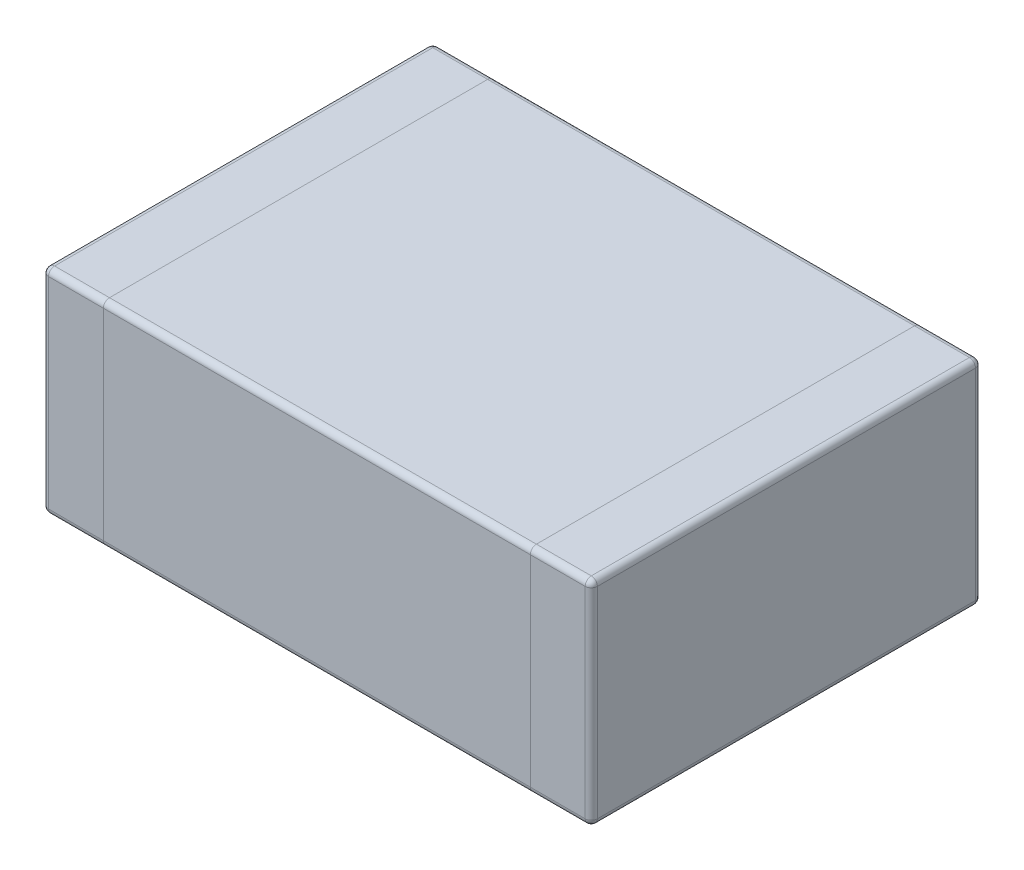
ISO-10303-21;
HEADER;
FILE_DESCRIPTION(('STEP AP214'),'2;1');
FILE_NAME('part.step','',(''),(''),'','','');
FILE_SCHEMA(('AUTOMOTIVE_DESIGN { 1 0 10303 214 1 1 1 1 }'));
ENDSEC;
DATA;
#1=APPLICATION_CONTEXT('core data for automotive mechanical design processes');
#2=APPLICATION_PROTOCOL_DEFINITION('international standard','automotive_design',2000,#1);
#3=PRODUCT_CONTEXT('',#1,'mechanical');
#4=PRODUCT('Part','Part','',(#3));
#5=PRODUCT_RELATED_PRODUCT_CATEGORY('part','',(#4));
#6=PRODUCT_DEFINITION_FORMATION('','',#4);
#7=PRODUCT_DEFINITION_CONTEXT('part definition',#1,'design');
#8=PRODUCT_DEFINITION('design','',#6,#7);
#9=PRODUCT_DEFINITION_SHAPE('','',#8);
#10=(LENGTH_UNIT() NAMED_UNIT(*) SI_UNIT(.MILLI.,.METRE.));
#11=(NAMED_UNIT(*) PLANE_ANGLE_UNIT() SI_UNIT($,.RADIAN.));
#12=(NAMED_UNIT(*) SI_UNIT($,.STERADIAN.) SOLID_ANGLE_UNIT());
#13=UNCERTAINTY_MEASURE_WITH_UNIT(LENGTH_MEASURE(1.E-05),#10,'distance_accuracy_value','');
#14=(GEOMETRIC_REPRESENTATION_CONTEXT(3) GLOBAL_UNCERTAINTY_ASSIGNED_CONTEXT((#13)) GLOBAL_UNIT_ASSIGNED_CONTEXT((#10,
#11,#12)) REPRESENTATION_CONTEXT('',''));
#15=CARTESIAN_POINT('',(0.,0.,0.));
#16=DIRECTION('',(0.,0.,1.));
#17=DIRECTION('',(1.,0.,0.));
#18=AXIS2_PLACEMENT_3D('',#15,#16,#17);
#19=CARTESIAN_POINT('',(2.25,1.75,-1.6));
#20=DIRECTION('',(0.,-1.,0.));
#21=DIRECTION('',(0.,0.,-1.));
#22=AXIS2_PLACEMENT_3D('',#19,#20,#21);
#23=PLANE('',#22);
#24=DIRECTION('',(0.,0.,1.));
#25=VECTOR('',#24,1.);
#26=CARTESIAN_POINT('',(-1.75,1.75,-1.6));
#27=LINE('',#26,#25);
#28=CARTESIAN_POINT('',(-1.75,1.75,-1.55));
#29=VERTEX_POINT('',#28);
#30=CARTESIAN_POINT('',(-1.75,1.75,1.55));
#31=VERTEX_POINT('',#30);
#32=EDGE_CURVE('E11',#29,#31,#27,.T.);
#33=ORIENTED_EDGE('',*,*,#32,.F.);
#34=DIRECTION('',(-1.,0.,0.));
#35=VECTOR('',#34,1.);
#36=CARTESIAN_POINT('',(2.25,1.75,-1.55));
#37=LINE('',#36,#35);
#38=CARTESIAN_POINT('',(-2.2,1.75,-1.55));
#39=VERTEX_POINT('',#38);
#40=EDGE_CURVE('E254',#29,#39,#37,.T.);
#41=ORIENTED_EDGE('',*,*,#40,.T.);
#42=DIRECTION('',(0.,0.,1.));
#43=VECTOR('',#42,1.);
#44=CARTESIAN_POINT('',(-2.2,1.75,-1.6));
#45=LINE('',#44,#43);
#46=CARTESIAN_POINT('',(-2.2,1.75,1.55));
#47=VERTEX_POINT('',#46);
#48=EDGE_CURVE('E257',#39,#47,#45,.T.);
#49=ORIENTED_EDGE('',*,*,#48,.T.);
#50=DIRECTION('',(1.,0.,0.));
#51=VECTOR('',#50,1.);
#52=CARTESIAN_POINT('',(2.25,1.75,1.55));
#53=LINE('',#52,#51);
#54=EDGE_CURVE('E261',#47,#31,#53,.T.);
#55=ORIENTED_EDGE('',*,*,#54,.T.);
#56=EDGE_LOOP('',(#33,#41,#49,#55));
#57=FACE_BOUND('',#56,.T.);
#58=ADVANCED_FACE('F38',(#57),#23,.F.);
#59=DIRECTION('',(0.,0.,-1.));
#60=VECTOR('',#59,1.);
#61=CARTESIAN_POINT('',(1.75,1.75,-1.6));
#62=LINE('',#61,#60);
#63=CARTESIAN_POINT('',(1.75,1.75,1.55));
#64=VERTEX_POINT('',#63);
#65=CARTESIAN_POINT('',(1.75,1.75,-1.55));
#66=VERTEX_POINT('',#65);
#67=EDGE_CURVE('E48',#64,#66,#62,.T.);
#68=ORIENTED_EDGE('',*,*,#67,.F.);
#69=CARTESIAN_POINT('',(2.2,1.75,1.55));
#70=VERTEX_POINT('',#69);
#71=EDGE_CURVE('E260',#64,#70,#53,.T.);
#72=ORIENTED_EDGE('',*,*,#71,.T.);
#73=DIRECTION('',(0.,0.,-1.));
#74=VECTOR('',#73,1.);
#75=CARTESIAN_POINT('',(2.2,1.75,-1.6));
#76=LINE('',#75,#74);
#77=CARTESIAN_POINT('',(2.2,1.75,-1.55));
#78=VERTEX_POINT('',#77);
#79=EDGE_CURVE('E251',#70,#78,#76,.T.);
#80=ORIENTED_EDGE('',*,*,#79,.T.);
#81=EDGE_CURVE('E255',#78,#66,#37,.T.);
#82=ORIENTED_EDGE('',*,*,#81,.T.);
#83=EDGE_LOOP('',(#68,#72,#80,#82));
#84=FACE_BOUND('',#83,.T.);
#85=ADVANCED_FACE('F527',(#84),#23,.F.);
#86=CARTESIAN_POINT('',(2.25,1.7,1.55));
#87=DIRECTION('',(1.,0.,0.));
#88=DIRECTION('',(0.,0.,-1.));
#89=AXIS2_PLACEMENT_3D('',#86,#87,#88);
#90=CYLINDRICAL_SURFACE('',#89,0.05);
#91=DIRECTION('',(1.,0.,0.));
#92=VECTOR('',#91,1.);
#93=CARTESIAN_POINT('',(-2.25,1.7,1.6));
#94=LINE('',#93,#92);
#95=CARTESIAN_POINT('',(-1.75,1.7,1.6));
#96=VERTEX_POINT('',#95);
#97=CARTESIAN_POINT('',(-2.2,1.7,1.6));
#98=VERTEX_POINT('',#97);
#99=EDGE_CURVE('E247',#96,#98,#94,.F.);
#100=ORIENTED_EDGE('',*,*,#99,.F.);
#101=CARTESIAN_POINT('',(-1.75,1.7,1.55));
#102=DIRECTION('',(1.,0.,0.));
#103=DIRECTION('',(0.,0.,-1.));
#104=AXIS2_PLACEMENT_3D('',#101,#102,#103);
#105=CIRCLE('',#104,0.05);
#106=EDGE_CURVE('E355',#96,#31,#105,.F.);
#107=ORIENTED_EDGE('',*,*,#106,.T.);
#108=ORIENTED_EDGE('',*,*,#54,.F.);
#109=CARTESIAN_POINT('',(-2.2,1.7,1.55));
#110=DIRECTION('',(-1.,0.,0.));
#111=DIRECTION('',(0.,-1.,0.));
#112=AXIS2_PLACEMENT_3D('',#109,#110,#111);
#113=CIRCLE('',#112,0.05);
#114=EDGE_CURVE('E331',#47,#98,#113,.F.);
#115=ORIENTED_EDGE('',*,*,#114,.T.);
#116=EDGE_LOOP('',(#100,#107,#108,#115));
#117=FACE_BOUND('',#116,.T.);
#118=ADVANCED_FACE('F484',(#117),#90,.T.);
#119=ORIENTED_EDGE('',*,*,#71,.F.);
#120=CARTESIAN_POINT('',(1.75,1.7,1.55));
#121=DIRECTION('',(-1.,0.,0.));
#122=DIRECTION('',(0.,0.,1.));
#123=AXIS2_PLACEMENT_3D('',#120,#121,#122);
#124=CIRCLE('',#123,0.05);
#125=CARTESIAN_POINT('',(1.75,1.7,1.6));
#126=VERTEX_POINT('',#125);
#127=EDGE_CURVE('E354',#64,#126,#124,.F.);
#128=ORIENTED_EDGE('',*,*,#127,.T.);
#129=CARTESIAN_POINT('',(2.2,1.7,1.6));
#130=VERTEX_POINT('',#129);
#131=EDGE_CURVE('E248',#130,#126,#94,.F.);
#132=ORIENTED_EDGE('',*,*,#131,.F.);
#133=CARTESIAN_POINT('',(2.2,1.7,1.55));
#134=DIRECTION('',(1.,0.,0.));
#135=DIRECTION('',(0.,0.,-1.));
#136=AXIS2_PLACEMENT_3D('',#133,#134,#135);
#137=CIRCLE('',#136,0.05);
#138=EDGE_CURVE('E316',#70,#130,#137,.T.);
#139=ORIENTED_EDGE('',*,*,#138,.F.);
#140=EDGE_LOOP('',(#119,#128,#132,#139));
#141=FACE_BOUND('',#140,.T.);
#142=ADVANCED_FACE('F458',(#141),#90,.T.);
#143=CARTESIAN_POINT('',(-2.25,1.75,1.6));
#144=DIRECTION('',(0.,0.,-1.));
#145=DIRECTION('',(-1.,0.,0.));
#146=AXIS2_PLACEMENT_3D('',#143,#144,#145);
#147=PLANE('',#146);
#148=DIRECTION('',(0.,-1.,0.));
#149=VECTOR('',#148,1.);
#150=CARTESIAN_POINT('',(-1.75,1.75,1.6));
#151=LINE('',#150,#149);
#152=CARTESIAN_POINT('',(-1.75,0.0499999999999999,1.6));
#153=VERTEX_POINT('',#152);
#154=EDGE_CURVE('E350',#96,#153,#151,.T.);
#155=ORIENTED_EDGE('',*,*,#154,.F.);
#156=ORIENTED_EDGE('',*,*,#99,.T.);
#157=DIRECTION('',(0.,-1.,0.));
#158=VECTOR('',#157,1.);
#159=CARTESIAN_POINT('',(-2.2,1.75,1.6));
#160=LINE('',#159,#158);
#161=CARTESIAN_POINT('',(-2.2,0.0499999999999999,1.6));
#162=VERTEX_POINT('',#161);
#163=EDGE_CURVE('E244',#98,#162,#160,.T.);
#164=ORIENTED_EDGE('',*,*,#163,.T.);
#165=DIRECTION('',(1.,0.,0.));
#166=VECTOR('',#165,1.);
#167=CARTESIAN_POINT('',(2.25,0.0499999999999999,1.6));
#168=LINE('',#167,#166);
#169=EDGE_CURVE('E238',#162,#153,#168,.T.);
#170=ORIENTED_EDGE('',*,*,#169,.T.);
#171=EDGE_LOOP('',(#155,#156,#164,#170));
#172=FACE_BOUND('',#171,.T.);
#173=ADVANCED_FACE('F472',(#172),#147,.F.);
#174=DIRECTION('',(0.,1.,0.));
#175=VECTOR('',#174,1.);
#176=CARTESIAN_POINT('',(1.75,1.75,1.6));
#177=LINE('',#176,#175);
#178=CARTESIAN_POINT('',(1.75,0.0499999999999999,1.6));
#179=VERTEX_POINT('',#178);
#180=EDGE_CURVE('E346',#179,#126,#177,.T.);
#181=ORIENTED_EDGE('',*,*,#180,.F.);
#182=CARTESIAN_POINT('',(2.2,0.0499999999999999,1.6));
#183=VERTEX_POINT('',#182);
#184=EDGE_CURVE('E237',#179,#183,#168,.T.);
#185=ORIENTED_EDGE('',*,*,#184,.T.);
#186=DIRECTION('',(0.,-1.,0.));
#187=VECTOR('',#186,1.);
#188=CARTESIAN_POINT('',(2.2,1.75,1.6));
#189=LINE('',#188,#187);
#190=EDGE_CURVE('E241',#183,#130,#189,.F.);
#191=ORIENTED_EDGE('',*,*,#190,.T.);
#192=ORIENTED_EDGE('',*,*,#131,.T.);
#193=EDGE_LOOP('',(#181,#185,#191,#192));
#194=FACE_BOUND('',#193,.T.);
#195=ADVANCED_FACE('F454',(#194),#147,.F.);
#196=CARTESIAN_POINT('',(-2.25,0.0499999999999999,1.55));
#197=DIRECTION('',(-1.,0.,0.));
#198=DIRECTION('',(0.,0.,1.));
#199=AXIS2_PLACEMENT_3D('',#196,#197,#198);
#200=CYLINDRICAL_SURFACE('',#199,0.05);
#201=DIRECTION('',(1.,0.,0.));
#202=VECTOR('',#201,1.);
#203=CARTESIAN_POINT('',(-2.25,0.,1.55));
#204=LINE('',#203,#202);
#205=CARTESIAN_POINT('',(-1.75,0.,1.55));
#206=VERTEX_POINT('',#205);
#207=CARTESIAN_POINT('',(-2.2,0.,1.55));
#208=VERTEX_POINT('',#207);
#209=EDGE_CURVE('E267',#206,#208,#204,.F.);
#210=ORIENTED_EDGE('',*,*,#209,.F.);
#211=CARTESIAN_POINT('',(-1.75,0.0499999999999999,1.55));
#212=DIRECTION('',(1.,0.,0.));
#213=DIRECTION('',(0.,0.,-1.));
#214=AXIS2_PLACEMENT_3D('',#211,#212,#213);
#215=CIRCLE('',#214,0.05);
#216=EDGE_CURVE('E351',#206,#153,#215,.F.);
#217=ORIENTED_EDGE('',*,*,#216,.T.);
#218=ORIENTED_EDGE('',*,*,#169,.F.);
#219=CARTESIAN_POINT('',(-2.2,0.05,1.55));
#220=DIRECTION('',(-1.,0.,0.));
#221=DIRECTION('',(0.,0.,1.));
#222=AXIS2_PLACEMENT_3D('',#219,#220,#221);
#223=CIRCLE('',#222,0.05);
#224=EDGE_CURVE('E322',#162,#208,#223,.F.);
#225=ORIENTED_EDGE('',*,*,#224,.T.);
#226=EDGE_LOOP('',(#210,#217,#218,#225));
#227=FACE_BOUND('',#226,.T.);
#228=ADVANCED_FACE('F510',(#227),#200,.T.);
#229=ORIENTED_EDGE('',*,*,#184,.F.);
#230=CARTESIAN_POINT('',(1.75,0.0499999999999999,1.55));
#231=DIRECTION('',(-1.,0.,0.));
#232=DIRECTION('',(0.,0.,1.));
#233=AXIS2_PLACEMENT_3D('',#230,#231,#232);
#234=CIRCLE('',#233,0.05);
#235=CARTESIAN_POINT('',(1.75,0.,1.55));
#236=VERTEX_POINT('',#235);
#237=EDGE_CURVE('E366',#179,#236,#234,.F.);
#238=ORIENTED_EDGE('',*,*,#237,.T.);
#239=CARTESIAN_POINT('',(2.2,0.,1.55));
#240=VERTEX_POINT('',#239);
#241=EDGE_CURVE('E268',#240,#236,#204,.F.);
#242=ORIENTED_EDGE('',*,*,#241,.F.);
#243=CARTESIAN_POINT('',(2.2,0.0499999999999999,1.55));
#244=DIRECTION('',(1.,0.,0.));
#245=DIRECTION('',(0.,0.,-1.));
#246=AXIS2_PLACEMENT_3D('',#243,#244,#245);
#247=CIRCLE('',#246,0.05);
#248=EDGE_CURVE('E302',#183,#240,#247,.T.);
#249=ORIENTED_EDGE('',*,*,#248,.F.);
#250=EDGE_LOOP('',(#229,#238,#242,#249));
#251=FACE_BOUND('',#250,.T.);
#252=ADVANCED_FACE('F444',(#251),#200,.T.);
#253=CARTESIAN_POINT('',(2.25,0.,-1.6));
#254=DIRECTION('',(0.,-1.,0.));
#255=DIRECTION('',(0.,0.,-1.));
#256=AXIS2_PLACEMENT_3D('',#253,#254,#255);
#257=PLANE('',#256);
#258=DIRECTION('',(-1.,0.,0.));
#259=VECTOR('',#258,1.);
#260=CARTESIAN_POINT('',(2.25,0.,-1.55));
#261=LINE('',#260,#259);
#262=CARTESIAN_POINT('',(-2.2,0.,-1.55));
#263=VERTEX_POINT('',#262);
#264=CARTESIAN_POINT('',(-1.75,0.,-1.55));
#265=VERTEX_POINT('',#264);
#266=EDGE_CURVE('E275',#263,#265,#261,.F.);
#267=ORIENTED_EDGE('',*,*,#266,.T.);
#268=DIRECTION('',(0.,0.,1.));
#269=VECTOR('',#268,1.);
#270=CARTESIAN_POINT('',(-1.75,0.,-1.6));
#271=LINE('',#270,#269);
#272=EDGE_CURVE('E367',#265,#206,#271,.T.);
#273=ORIENTED_EDGE('',*,*,#272,.T.);
#274=ORIENTED_EDGE('',*,*,#209,.T.);
#275=DIRECTION('',(0.,0.,1.));
#276=VECTOR('',#275,1.);
#277=CARTESIAN_POINT('',(-2.2,0.,-1.6));
#278=LINE('',#277,#276);
#279=EDGE_CURVE('E271',#208,#263,#278,.F.);
#280=ORIENTED_EDGE('',*,*,#279,.T.);
#281=EDGE_LOOP('',(#267,#273,#274,#280));
#282=FACE_BOUND('',#281,.T.);
#283=ADVANCED_FACE('F513',(#282),#257,.T.);
#284=ORIENTED_EDGE('',*,*,#241,.T.);
#285=DIRECTION('',(0.,0.,-1.));
#286=VECTOR('',#285,1.);
#287=CARTESIAN_POINT('',(1.75,0.,-1.6));
#288=LINE('',#287,#286);
#289=CARTESIAN_POINT('',(1.75,0.,-1.55));
#290=VERTEX_POINT('',#289);
#291=EDGE_CURVE('E361',#236,#290,#288,.T.);
#292=ORIENTED_EDGE('',*,*,#291,.T.);
#293=CARTESIAN_POINT('',(2.2,0.,-1.55));
#294=VERTEX_POINT('',#293);
#295=EDGE_CURVE('E274',#290,#294,#261,.F.);
#296=ORIENTED_EDGE('',*,*,#295,.T.);
#297=DIRECTION('',(0.,0.,-1.));
#298=VECTOR('',#297,1.);
#299=CARTESIAN_POINT('',(2.2,0.,1.6));
#300=LINE('',#299,#298);
#301=EDGE_CURVE('E264',#294,#240,#300,.F.);
#302=ORIENTED_EDGE('',*,*,#301,.T.);
#303=EDGE_LOOP('',(#284,#292,#296,#302));
#304=FACE_BOUND('',#303,.T.);
#305=ADVANCED_FACE('F388',(#304),#257,.T.);
#306=CARTESIAN_POINT('',(2.25,1.7,-1.55));
#307=DIRECTION('',(-1.,0.,0.));
#308=DIRECTION('',(0.,0.,1.));
#309=AXIS2_PLACEMENT_3D('',#306,#307,#308);
#310=CYLINDRICAL_SURFACE('',#309,0.05);
#311=ORIENTED_EDGE('',*,*,#40,.F.);
#312=CARTESIAN_POINT('',(-1.75,1.7,-1.55));
#313=DIRECTION('',(1.,0.,0.));
#314=DIRECTION('',(0.,0.,-1.));
#315=AXIS2_PLACEMENT_3D('',#312,#313,#314);
#316=CIRCLE('',#315,0.05);
#317=CARTESIAN_POINT('',(-1.75,1.7,-1.6));
#318=VERTEX_POINT('',#317);
#319=EDGE_CURVE('E358',#29,#318,#316,.F.);
#320=ORIENTED_EDGE('',*,*,#319,.T.);
#321=DIRECTION('',(-1.,0.,0.));
#322=VECTOR('',#321,1.);
#323=CARTESIAN_POINT('',(-2.25,1.7,-1.6));
#324=LINE('',#323,#322);
#325=CARTESIAN_POINT('',(-2.2,1.7,-1.6));
#326=VERTEX_POINT('',#325);
#327=EDGE_CURVE('E217',#326,#318,#324,.F.);
#328=ORIENTED_EDGE('',*,*,#327,.F.);
#329=CARTESIAN_POINT('',(-2.2,1.7,-1.55));
#330=DIRECTION('',(-1.,0.,0.));
#331=DIRECTION('',(0.,0.,1.));
#332=AXIS2_PLACEMENT_3D('',#329,#330,#331);
#333=CIRCLE('',#332,0.05);
#334=EDGE_CURVE('E293',#326,#39,#333,.F.);
#335=ORIENTED_EDGE('',*,*,#334,.T.);
#336=EDGE_LOOP('',(#311,#320,#328,#335));
#337=FACE_BOUND('',#336,.T.);
#338=ADVANCED_FACE('F520',(#337),#310,.T.);
#339=CARTESIAN_POINT('',(1.75,1.7,-1.6));
#340=VERTEX_POINT('',#339);
#341=CARTESIAN_POINT('',(2.2,1.7,-1.6));
#342=VERTEX_POINT('',#341);
#343=EDGE_CURVE('E212',#340,#342,#324,.F.);
#344=ORIENTED_EDGE('',*,*,#343,.F.);
#345=CARTESIAN_POINT('',(1.75,1.7,-1.55));
#346=DIRECTION('',(-1.,0.,0.));
#347=DIRECTION('',(0.,0.,1.));
#348=AXIS2_PLACEMENT_3D('',#345,#346,#347);
#349=CIRCLE('',#348,0.05);
#350=EDGE_CURVE('E362',#340,#66,#349,.F.);
#351=ORIENTED_EDGE('',*,*,#350,.T.);
#352=ORIENTED_EDGE('',*,*,#81,.F.);
#353=CARTESIAN_POINT('',(2.2,1.7,-1.55));
#354=DIRECTION('',(1.,0.,0.));
#355=DIRECTION('',(0.,0.,-1.));
#356=AXIS2_PLACEMENT_3D('',#353,#354,#355);
#357=CIRCLE('',#356,0.05);
#358=EDGE_CURVE('E197',#342,#78,#357,.T.);
#359=ORIENTED_EDGE('',*,*,#358,.F.);
#360=EDGE_LOOP('',(#344,#351,#352,#359));
#361=FACE_BOUND('',#360,.T.);
#362=ADVANCED_FACE('F423',(#361),#310,.T.);
#363=CARTESIAN_POINT('',(-2.25,0.0499999999999999,-1.55));
#364=DIRECTION('',(1.,0.,0.));
#365=DIRECTION('',(0.,0.,-1.));
#366=AXIS2_PLACEMENT_3D('',#363,#364,#365);
#367=CYLINDRICAL_SURFACE('',#366,0.05);
#368=DIRECTION('',(-1.,0.,0.));
#369=VECTOR('',#368,1.);
#370=CARTESIAN_POINT('',(-2.25,0.0499999999999999,-1.6));
#371=LINE('',#370,#369);
#372=CARTESIAN_POINT('',(-1.75,0.0499999999999999,-1.6));
#373=VERTEX_POINT('',#372);
#374=CARTESIAN_POINT('',(-2.2,0.0499999999999999,-1.6));
#375=VERTEX_POINT('',#374);
#376=EDGE_CURVE('E209',#373,#375,#371,.T.);
#377=ORIENTED_EDGE('',*,*,#376,.F.);
#378=CARTESIAN_POINT('',(-1.75,0.0499999999999999,-1.55));
#379=DIRECTION('',(1.,0.,0.));
#380=DIRECTION('',(0.,0.,-1.));
#381=AXIS2_PLACEMENT_3D('',#378,#379,#380);
#382=CIRCLE('',#381,0.05);
#383=EDGE_CURVE('E371',#373,#265,#382,.F.);
#384=ORIENTED_EDGE('',*,*,#383,.T.);
#385=ORIENTED_EDGE('',*,*,#266,.F.);
#386=CARTESIAN_POINT('',(-2.2,0.0499999999999999,-1.55));
#387=DIRECTION('',(-1.,0.,0.));
#388=DIRECTION('',(0.,0.,1.));
#389=AXIS2_PLACEMENT_3D('',#386,#387,#388);
#390=CIRCLE('',#389,0.05);
#391=EDGE_CURVE('E290',#263,#375,#390,.F.);
#392=ORIENTED_EDGE('',*,*,#391,.T.);
#393=EDGE_LOOP('',(#377,#384,#385,#392));
#394=FACE_BOUND('',#393,.T.);
#395=ADVANCED_FACE('F406',(#394),#367,.T.);
#396=ORIENTED_EDGE('',*,*,#295,.F.);
#397=CARTESIAN_POINT('',(1.75,0.0499999999999999,-1.55));
#398=DIRECTION('',(-1.,0.,0.));
#399=DIRECTION('',(0.,0.,1.));
#400=AXIS2_PLACEMENT_3D('',#397,#398,#399);
#401=CIRCLE('',#400,0.05);
#402=CARTESIAN_POINT('',(1.75,0.0499999999999999,-1.6));
#403=VERTEX_POINT('',#402);
#404=EDGE_CURVE('E42',#290,#403,#401,.F.);
#405=ORIENTED_EDGE('',*,*,#404,.T.);
#406=CARTESIAN_POINT('',(2.2,0.0499999999999999,-1.6));
#407=VERTEX_POINT('',#406);
#408=EDGE_CURVE('E200',#407,#403,#371,.T.);
#409=ORIENTED_EDGE('',*,*,#408,.F.);
#410=CARTESIAN_POINT('',(2.2,0.05,-1.55));
#411=DIRECTION('',(1.,0.,0.));
#412=DIRECTION('',(0.,0.,-1.));
#413=AXIS2_PLACEMENT_3D('',#410,#411,#412);
#414=CIRCLE('',#413,0.05);
#415=EDGE_CURVE('E189',#294,#407,#414,.T.);
#416=ORIENTED_EDGE('',*,*,#415,.F.);
#417=EDGE_LOOP('',(#396,#405,#409,#416));
#418=FACE_BOUND('',#417,.T.);
#419=ADVANCED_FACE('F201',(#418),#367,.T.);
#420=CARTESIAN_POINT('',(-2.25,1.75,-1.6));
#421=DIRECTION('',(0.,0.,1.));
#422=DIRECTION('',(1.,0.,0.));
#423=AXIS2_PLACEMENT_3D('',#420,#421,#422);
#424=PLANE('',#423);
#425=DIRECTION('',(0.,1.,0.));
#426=VECTOR('',#425,1.);
#427=CARTESIAN_POINT('',(-1.75,1.75,-1.6));
#428=LINE('',#427,#426);
#429=EDGE_CURVE('E342',#373,#318,#428,.T.);
#430=ORIENTED_EDGE('',*,*,#429,.F.);
#431=ORIENTED_EDGE('',*,*,#376,.T.);
#432=DIRECTION('',(0.,-1.,0.));
#433=VECTOR('',#432,1.);
#434=CARTESIAN_POINT('',(-2.2,1.75,-1.6));
#435=LINE('',#434,#433);
#436=EDGE_CURVE('E206',#375,#326,#435,.F.);
#437=ORIENTED_EDGE('',*,*,#436,.T.);
#438=ORIENTED_EDGE('',*,*,#327,.T.);
#439=EDGE_LOOP('',(#430,#431,#437,#438));
#440=FACE_BOUND('',#439,.T.);
#441=ADVANCED_FACE('F409',(#440),#424,.F.);
#442=DIRECTION('',(0.,-1.,0.));
#443=VECTOR('',#442,1.);
#444=CARTESIAN_POINT('',(1.75,1.75,-1.6));
#445=LINE('',#444,#443);
#446=EDGE_CURVE('E277',#340,#403,#445,.T.);
#447=ORIENTED_EDGE('',*,*,#446,.F.);
#448=ORIENTED_EDGE('',*,*,#343,.T.);
#449=DIRECTION('',(0.,-1.,0.));
#450=VECTOR('',#449,1.);
#451=CARTESIAN_POINT('',(2.2,1.75,-1.6));
#452=LINE('',#451,#450);
#453=EDGE_CURVE('E181',#342,#407,#452,.T.);
#454=ORIENTED_EDGE('',*,*,#453,.T.);
#455=ORIENTED_EDGE('',*,*,#408,.T.);
#456=EDGE_LOOP('',(#447,#448,#454,#455));
#457=FACE_BOUND('',#456,.T.);
#458=ADVANCED_FACE('F210',(#457),#424,.F.);
#459=CARTESIAN_POINT('',(2.25,1.75,1.6));
#460=DIRECTION('',(-1.,0.,0.));
#461=DIRECTION('',(0.,0.,1.));
#462=AXIS2_PLACEMENT_3D('',#459,#460,#461);
#463=PLANE('',#462);
#464=DIRECTION('',(0.,-1.,0.));
#465=VECTOR('',#464,1.);
#466=CARTESIAN_POINT('',(2.25,1.75,-1.55));
#467=LINE('',#466,#465);
#468=CARTESIAN_POINT('',(2.25,0.0499999999999999,-1.55));
#469=VERTEX_POINT('',#468);
#470=CARTESIAN_POINT('',(2.25,1.7,-1.55));
#471=VERTEX_POINT('',#470);
#472=EDGE_CURVE('E183',#469,#471,#467,.F.);
#473=ORIENTED_EDGE('',*,*,#472,.T.);
#474=DIRECTION('',(0.,0.,-1.));
#475=VECTOR('',#474,1.);
#476=CARTESIAN_POINT('',(2.25,1.7,1.6));
#477=LINE('',#476,#475);
#478=CARTESIAN_POINT('',(2.25,1.7,1.55));
#479=VERTEX_POINT('',#478);
#480=EDGE_CURVE('E226',#471,#479,#477,.F.);
#481=ORIENTED_EDGE('',*,*,#480,.T.);
#482=DIRECTION('',(0.,-1.,0.));
#483=VECTOR('',#482,1.);
#484=CARTESIAN_POINT('',(2.25,1.75,1.55));
#485=LINE('',#484,#483);
#486=CARTESIAN_POINT('',(2.25,0.0499999999999999,1.55));
#487=VERTEX_POINT('',#486);
#488=EDGE_CURVE('E223',#479,#487,#485,.T.);
#489=ORIENTED_EDGE('',*,*,#488,.T.);
#490=DIRECTION('',(0.,0.,-1.));
#491=VECTOR('',#490,1.);
#492=CARTESIAN_POINT('',(2.25,0.0499999999999999,-1.6));
#493=LINE('',#492,#491);
#494=EDGE_CURVE('E221',#487,#469,#493,.T.);
#495=ORIENTED_EDGE('',*,*,#494,.T.);
#496=EDGE_LOOP('',(#473,#481,#489,#495));
#497=FACE_BOUND('',#496,.T.);
#498=ADVANCED_FACE('F435',(#497),#463,.F.);
#499=EDGE_CURVE('E207',#403,#373,#371,.T.);
#500=ORIENTED_EDGE('',*,*,#499,.T.);
#501=ORIENTED_EDGE('',*,*,#429,.T.);
#502=EDGE_CURVE('E215',#318,#340,#324,.F.);
#503=ORIENTED_EDGE('',*,*,#502,.T.);
#504=ORIENTED_EDGE('',*,*,#446,.T.);
#505=EDGE_LOOP('',(#500,#501,#503,#504));
#506=FACE_BOUND('',#505,.T.);
#507=ADVANCED_FACE('F415',(#506),#424,.F.);
#508=CARTESIAN_POINT('',(-2.25,1.75,1.6));
#509=DIRECTION('',(1.,0.,0.));
#510=DIRECTION('',(0.,0.,-1.));
#511=AXIS2_PLACEMENT_3D('',#508,#509,#510);
#512=PLANE('',#511);
#513=DIRECTION('',(0.,-1.,0.));
#514=VECTOR('',#513,1.);
#515=CARTESIAN_POINT('',(-2.25,1.75,1.55));
#516=LINE('',#515,#514);
#517=CARTESIAN_POINT('',(-2.25,0.0499999999999999,1.55));
#518=VERTEX_POINT('',#517);
#519=CARTESIAN_POINT('',(-2.25,1.7,1.55));
#520=VERTEX_POINT('',#519);
#521=EDGE_CURVE('E230',#518,#520,#516,.F.);
#522=ORIENTED_EDGE('',*,*,#521,.T.);
#523=DIRECTION('',(0.,0.,1.));
#524=VECTOR('',#523,1.);
#525=CARTESIAN_POINT('',(-2.25,1.7,1.6));
#526=LINE('',#525,#524);
#527=CARTESIAN_POINT('',(-2.25,1.7,-1.55));
#528=VERTEX_POINT('',#527);
#529=EDGE_CURVE('E235',#520,#528,#526,.F.);
#530=ORIENTED_EDGE('',*,*,#529,.T.);
#531=DIRECTION('',(0.,-1.,0.));
#532=VECTOR('',#531,1.);
#533=CARTESIAN_POINT('',(-2.25,1.75,-1.55));
#534=LINE('',#533,#532);
#535=CARTESIAN_POINT('',(-2.25,0.0499999999999999,-1.55));
#536=VERTEX_POINT('',#535);
#537=EDGE_CURVE('E232',#528,#536,#534,.T.);
#538=ORIENTED_EDGE('',*,*,#537,.T.);
#539=DIRECTION('',(0.,0.,1.));
#540=VECTOR('',#539,1.);
#541=CARTESIAN_POINT('',(-2.25,0.0499999999999999,1.6));
#542=LINE('',#541,#540);
#543=EDGE_CURVE('E228',#536,#518,#542,.T.);
#544=ORIENTED_EDGE('',*,*,#543,.T.);
#545=EDGE_LOOP('',(#522,#530,#538,#544));
#546=FACE_BOUND('',#545,.T.);
#547=ADVANCED_FACE('F492',(#546),#512,.F.);
#548=EDGE_CURVE('E252',#126,#96,#94,.F.);
#549=ORIENTED_EDGE('',*,*,#548,.T.);
#550=ORIENTED_EDGE('',*,*,#154,.T.);
#551=EDGE_CURVE('E242',#153,#179,#168,.T.);
#552=ORIENTED_EDGE('',*,*,#551,.T.);
#553=ORIENTED_EDGE('',*,*,#180,.T.);
#554=EDGE_LOOP('',(#549,#550,#552,#553));
#555=FACE_BOUND('',#554,.T.);
#556=ADVANCED_FACE('F465',(#555),#147,.F.);
#557=EDGE_CURVE('E258',#66,#29,#37,.T.);
#558=ORIENTED_EDGE('',*,*,#557,.T.);
#559=ORIENTED_EDGE('',*,*,#32,.T.);
#560=EDGE_CURVE('E265',#31,#64,#53,.T.);
#561=ORIENTED_EDGE('',*,*,#560,.T.);
#562=ORIENTED_EDGE('',*,*,#67,.T.);
#563=EDGE_LOOP('',(#558,#559,#561,#562));
#564=FACE_BOUND('',#563,.T.);
#565=ADVANCED_FACE('F525',(#564),#23,.F.);
#566=ORIENTED_EDGE('',*,*,#272,.F.);
#567=EDGE_CURVE('E278',#265,#290,#261,.F.);
#568=ORIENTED_EDGE('',*,*,#567,.T.);
#569=ORIENTED_EDGE('',*,*,#291,.F.);
#570=EDGE_CURVE('E272',#236,#206,#204,.F.);
#571=ORIENTED_EDGE('',*,*,#570,.T.);
#572=EDGE_LOOP('',(#566,#568,#569,#571));
#573=FACE_BOUND('',#572,.T.);
#574=ADVANCED_FACE('F400',(#573),#257,.T.);
#575=CARTESIAN_POINT('',(-2.2,1.75,1.55));
#576=DIRECTION('',(0.,-1.,0.));
#577=DIRECTION('',(0.,0.,-1.));
#578=AXIS2_PLACEMENT_3D('',#575,#576,#577);
#579=CYLINDRICAL_SURFACE('',#578,0.05);
#580=CARTESIAN_POINT('',(-2.2,1.7,1.55));
#581=DIRECTION('',(0.,1.,0.));
#582=DIRECTION('',(0.,0.,1.));
#583=AXIS2_PLACEMENT_3D('',#580,#581,#582);
#584=CIRCLE('',#583,0.05);
#585=EDGE_CURVE('E337',#520,#98,#584,.T.);
#586=ORIENTED_EDGE('',*,*,#585,.F.);
#587=ORIENTED_EDGE('',*,*,#521,.F.);
#588=CARTESIAN_POINT('',(-2.2,0.0499999999999999,1.55));
#589=DIRECTION('',(0.,-1.,0.));
#590=DIRECTION('',(0.,0.,-1.));
#591=AXIS2_PLACEMENT_3D('',#588,#589,#590);
#592=CIRCLE('',#591,0.05);
#593=EDGE_CURVE('E334',#162,#518,#592,.T.);
#594=ORIENTED_EDGE('',*,*,#593,.F.);
#595=ORIENTED_EDGE('',*,*,#163,.F.);
#596=EDGE_LOOP('',(#586,#587,#594,#595));
#597=FACE_BOUND('',#596,.T.);
#598=ADVANCED_FACE('F40',(#597),#579,.T.);
#599=CARTESIAN_POINT('',(-2.2,1.7,1.55));
#600=DIRECTION('',(0.,0.,1.));
#601=DIRECTION('',(1.,0.,0.));
#602=AXIS2_PLACEMENT_3D('',#599,#600,#601);
#603=SPHERICAL_SURFACE('',#602,0.05);
#604=CARTESIAN_POINT('',(-2.2,1.7,1.55));
#605=DIRECTION('',(0.,0.,1.));
#606=DIRECTION('',(1.,0.,0.));
#607=AXIS2_PLACEMENT_3D('',#604,#605,#606);
#608=CIRCLE('',#607,0.05);
#609=EDGE_CURVE('E328',#520,#47,#608,.F.);
#610=ORIENTED_EDGE('',*,*,#609,.F.);
#611=ORIENTED_EDGE('',*,*,#585,.T.);
#612=ORIENTED_EDGE('',*,*,#114,.F.);
#613=EDGE_LOOP('',(#610,#611,#612));
#614=FACE_BOUND('',#613,.T.);
#615=ADVANCED_FACE('F481',(#614),#603,.T.);
#616=CARTESIAN_POINT('',(-2.2,0.05,1.55));
#617=DIRECTION('',(0.,0.,1.));
#618=DIRECTION('',(1.,0.,0.));
#619=AXIS2_PLACEMENT_3D('',#616,#617,#618);
#620=SPHERICAL_SURFACE('',#619,0.05);
#621=ORIENTED_EDGE('',*,*,#224,.F.);
#622=ORIENTED_EDGE('',*,*,#593,.T.);
#623=CARTESIAN_POINT('',(-2.2,0.0499999999999999,1.55));
#624=DIRECTION('',(0.,0.,1.));
#625=DIRECTION('',(1.,0.,0.));
#626=AXIS2_PLACEMENT_3D('',#623,#624,#625);
#627=CIRCLE('',#626,0.05);
#628=EDGE_CURVE('E325',#208,#518,#627,.F.);
#629=ORIENTED_EDGE('',*,*,#628,.F.);
#630=EDGE_LOOP('',(#621,#622,#629));
#631=FACE_BOUND('',#630,.T.);
#632=ADVANCED_FACE('F508',(#631),#620,.T.);
#633=ORIENTED_EDGE('',*,*,#106,.F.);
#634=ORIENTED_EDGE('',*,*,#548,.F.);
#635=ORIENTED_EDGE('',*,*,#127,.F.);
#636=ORIENTED_EDGE('',*,*,#560,.F.);
#637=EDGE_LOOP('',(#633,#634,#635,#636));
#638=FACE_BOUND('',#637,.T.);
#639=ADVANCED_FACE('F467',(#638),#90,.T.);
#640=CARTESIAN_POINT('',(-2.2,1.7,-1.6));
#641=DIRECTION('',(0.,0.,1.));
#642=DIRECTION('',(1.,0.,0.));
#643=AXIS2_PLACEMENT_3D('',#640,#641,#642);
#644=CYLINDRICAL_SURFACE('',#643,0.05);
#645=ORIENTED_EDGE('',*,*,#609,.T.);
#646=ORIENTED_EDGE('',*,*,#48,.F.);
#647=CARTESIAN_POINT('',(-2.2,1.7,-1.55));
#648=DIRECTION('',(0.,0.,-1.));
#649=DIRECTION('',(0.,1.,0.));
#650=AXIS2_PLACEMENT_3D('',#647,#648,#649);
#651=CIRCLE('',#650,0.05);
#652=EDGE_CURVE('E313',#528,#39,#651,.T.);
#653=ORIENTED_EDGE('',*,*,#652,.F.);
#654=ORIENTED_EDGE('',*,*,#529,.F.);
#655=EDGE_LOOP('',(#645,#646,#653,#654));
#656=FACE_BOUND('',#655,.T.);
#657=ADVANCED_FACE('F489',(#656),#644,.T.);
#658=CARTESIAN_POINT('',(-2.2,1.75,-1.55));
#659=DIRECTION('',(0.,-1.,0.));
#660=DIRECTION('',(0.,0.,-1.));
#661=AXIS2_PLACEMENT_3D('',#658,#659,#660);
#662=CYLINDRICAL_SURFACE('',#661,0.05);
#663=CARTESIAN_POINT('',(-2.2,0.0499999999999999,-1.55));
#664=DIRECTION('',(0.,-1.,0.));
#665=DIRECTION('',(0.,0.,-1.));
#666=AXIS2_PLACEMENT_3D('',#663,#664,#665);
#667=CIRCLE('',#666,0.05);
#668=EDGE_CURVE('E307',#536,#375,#667,.T.);
#669=ORIENTED_EDGE('',*,*,#668,.F.);
#670=ORIENTED_EDGE('',*,*,#537,.F.);
#671=CARTESIAN_POINT('',(-2.2,1.7,-1.55));
#672=DIRECTION('',(0.,1.,0.));
#673=DIRECTION('',(0.,0.,1.));
#674=AXIS2_PLACEMENT_3D('',#671,#672,#673);
#675=CIRCLE('',#674,0.05);
#676=EDGE_CURVE('E310',#326,#528,#675,.T.);
#677=ORIENTED_EDGE('',*,*,#676,.F.);
#678=ORIENTED_EDGE('',*,*,#436,.F.);
#679=EDGE_LOOP('',(#669,#670,#677,#678));
#680=FACE_BOUND('',#679,.T.);
#681=ADVANCED_FACE('F496',(#680),#662,.T.);
#682=CARTESIAN_POINT('',(-2.2,0.0499999999999999,1.6));
#683=DIRECTION('',(0.,0.,-1.));
#684=DIRECTION('',(-1.,0.,0.));
#685=AXIS2_PLACEMENT_3D('',#682,#683,#684);
#686=CYLINDRICAL_SURFACE('',#685,0.05);
#687=ORIENTED_EDGE('',*,*,#628,.T.);
#688=ORIENTED_EDGE('',*,*,#543,.F.);
#689=CARTESIAN_POINT('',(-2.2,0.05,-1.55));
#690=DIRECTION('',(0.,0.,-1.));
#691=DIRECTION('',(-1.,0.,0.));
#692=AXIS2_PLACEMENT_3D('',#689,#690,#691);
#693=CIRCLE('',#692,0.05);
#694=EDGE_CURVE('E305',#263,#536,#693,.T.);
#695=ORIENTED_EDGE('',*,*,#694,.F.);
#696=ORIENTED_EDGE('',*,*,#279,.F.);
#697=EDGE_LOOP('',(#687,#688,#695,#696));
#698=FACE_BOUND('',#697,.T.);
#699=ADVANCED_FACE('F503',(#698),#686,.T.);
#700=ORIENTED_EDGE('',*,*,#216,.F.);
#701=ORIENTED_EDGE('',*,*,#570,.F.);
#702=ORIENTED_EDGE('',*,*,#237,.F.);
#703=ORIENTED_EDGE('',*,*,#551,.F.);
#704=EDGE_LOOP('',(#700,#701,#702,#703));
#705=FACE_BOUND('',#704,.T.);
#706=ADVANCED_FACE('F512',(#705),#200,.T.);
#707=CARTESIAN_POINT('',(2.2,1.75,1.55));
#708=DIRECTION('',(0.,-1.,0.));
#709=DIRECTION('',(0.,0.,-1.));
#710=AXIS2_PLACEMENT_3D('',#707,#708,#709);
#711=CYLINDRICAL_SURFACE('',#710,0.05);
#712=CARTESIAN_POINT('',(2.2,1.7,1.55));
#713=DIRECTION('',(0.,1.,0.));
#714=DIRECTION('',(0.,0.,1.));
#715=AXIS2_PLACEMENT_3D('',#712,#713,#714);
#716=CIRCLE('',#715,0.05);
#717=EDGE_CURVE('E319',#130,#479,#716,.T.);
#718=ORIENTED_EDGE('',*,*,#717,.F.);
#719=ORIENTED_EDGE('',*,*,#190,.F.);
#720=CARTESIAN_POINT('',(2.2,0.0499999999999999,1.55));
#721=DIRECTION('',(0.,-1.,0.));
#722=DIRECTION('',(0.,0.,-1.));
#723=AXIS2_PLACEMENT_3D('',#720,#721,#722);
#724=CIRCLE('',#723,0.05);
#725=EDGE_CURVE('E299',#487,#183,#724,.T.);
#726=ORIENTED_EDGE('',*,*,#725,.F.);
#727=ORIENTED_EDGE('',*,*,#488,.F.);
#728=EDGE_LOOP('',(#718,#719,#726,#727));
#729=FACE_BOUND('',#728,.T.);
#730=ADVANCED_FACE('F451',(#729),#711,.T.);
#731=CARTESIAN_POINT('',(2.2,1.7,1.55));
#732=DIRECTION('',(0.,0.,1.));
#733=DIRECTION('',(1.,0.,0.));
#734=AXIS2_PLACEMENT_3D('',#731,#732,#733);
#735=SPHERICAL_SURFACE('',#734,0.05);
#736=ORIENTED_EDGE('',*,*,#138,.T.);
#737=ORIENTED_EDGE('',*,*,#717,.T.);
#738=CARTESIAN_POINT('',(2.2,1.7,1.55));
#739=DIRECTION('',(0.,0.,1.));
#740=DIRECTION('',(0.,-1.,0.));
#741=AXIS2_PLACEMENT_3D('',#738,#739,#740);
#742=CIRCLE('',#741,0.05);
#743=EDGE_CURVE('E296',#70,#479,#742,.F.);
#744=ORIENTED_EDGE('',*,*,#743,.F.);
#745=EDGE_LOOP('',(#736,#737,#744));
#746=FACE_BOUND('',#745,.T.);
#747=ADVANCED_FACE('F536',(#746),#735,.T.);
#748=CARTESIAN_POINT('',(-2.2,1.7,-1.55));
#749=DIRECTION('',(0.,0.,1.));
#750=DIRECTION('',(1.,0.,0.));
#751=AXIS2_PLACEMENT_3D('',#748,#749,#750);
#752=SPHERICAL_SURFACE('',#751,0.05);
#753=ORIENTED_EDGE('',*,*,#676,.T.);
#754=ORIENTED_EDGE('',*,*,#652,.T.);
#755=ORIENTED_EDGE('',*,*,#334,.F.);
#756=EDGE_LOOP('',(#753,#754,#755));
#757=FACE_BOUND('',#756,.T.);
#758=ADVANCED_FACE('F538',(#757),#752,.T.);
#759=CARTESIAN_POINT('',(-2.2,0.05,-1.55));
#760=DIRECTION('',(0.,0.,1.));
#761=DIRECTION('',(1.,0.,0.));
#762=AXIS2_PLACEMENT_3D('',#759,#760,#761);
#763=SPHERICAL_SURFACE('',#762,0.05);
#764=ORIENTED_EDGE('',*,*,#694,.T.);
#765=ORIENTED_EDGE('',*,*,#668,.T.);
#766=ORIENTED_EDGE('',*,*,#391,.F.);
#767=EDGE_LOOP('',(#764,#765,#766));
#768=FACE_BOUND('',#767,.T.);
#769=ADVANCED_FACE('F544',(#768),#763,.T.);
#770=CARTESIAN_POINT('',(2.2,0.05,1.55));
#771=DIRECTION('',(0.,0.,1.));
#772=DIRECTION('',(1.,0.,0.));
#773=AXIS2_PLACEMENT_3D('',#770,#771,#772);
#774=SPHERICAL_SURFACE('',#773,0.05);
#775=ORIENTED_EDGE('',*,*,#725,.T.);
#776=ORIENTED_EDGE('',*,*,#248,.T.);
#777=CARTESIAN_POINT('',(2.2,0.05,1.55));
#778=DIRECTION('',(0.,0.,1.));
#779=DIRECTION('',(1.,0.,0.));
#780=AXIS2_PLACEMENT_3D('',#777,#778,#779);
#781=CIRCLE('',#780,0.05);
#782=EDGE_CURVE('E287',#487,#240,#781,.F.);
#783=ORIENTED_EDGE('',*,*,#782,.F.);
#784=EDGE_LOOP('',(#775,#776,#783));
#785=FACE_BOUND('',#784,.T.);
#786=ADVANCED_FACE('F447',(#785),#774,.T.);
#787=CARTESIAN_POINT('',(2.2,1.7,-1.6));
#788=DIRECTION('',(0.,0.,-1.));
#789=DIRECTION('',(-1.,0.,0.));
#790=AXIS2_PLACEMENT_3D('',#787,#788,#789);
#791=CYLINDRICAL_SURFACE('',#790,0.05);
#792=ORIENTED_EDGE('',*,*,#743,.T.);
#793=ORIENTED_EDGE('',*,*,#480,.F.);
#794=CARTESIAN_POINT('',(2.2,1.7,-1.55));
#795=DIRECTION('',(0.,0.,-1.));
#796=DIRECTION('',(-1.,0.,0.));
#797=AXIS2_PLACEMENT_3D('',#794,#795,#796);
#798=CIRCLE('',#797,0.05);
#799=EDGE_CURVE('E284',#78,#471,#798,.T.);
#800=ORIENTED_EDGE('',*,*,#799,.F.);
#801=ORIENTED_EDGE('',*,*,#79,.F.);
#802=EDGE_LOOP('',(#792,#793,#800,#801));
#803=FACE_BOUND('',#802,.T.);
#804=ADVANCED_FACE('F431',(#803),#791,.T.);
#805=ORIENTED_EDGE('',*,*,#319,.F.);
#806=ORIENTED_EDGE('',*,*,#557,.F.);
#807=ORIENTED_EDGE('',*,*,#350,.F.);
#808=ORIENTED_EDGE('',*,*,#502,.F.);
#809=EDGE_LOOP('',(#805,#806,#807,#808));
#810=FACE_BOUND('',#809,.T.);
#811=ADVANCED_FACE('F418',(#810),#310,.T.);
#812=ORIENTED_EDGE('',*,*,#383,.F.);
#813=ORIENTED_EDGE('',*,*,#499,.F.);
#814=ORIENTED_EDGE('',*,*,#404,.F.);
#815=ORIENTED_EDGE('',*,*,#567,.F.);
#816=EDGE_LOOP('',(#812,#813,#814,#815));
#817=FACE_BOUND('',#816,.T.);
#818=ADVANCED_FACE('F397',(#817),#367,.T.);
#819=CARTESIAN_POINT('',(2.2,0.0499999999999999,1.6));
#820=DIRECTION('',(0.,0.,1.));
#821=DIRECTION('',(1.,0.,0.));
#822=AXIS2_PLACEMENT_3D('',#819,#820,#821);
#823=CYLINDRICAL_SURFACE('',#822,0.05);
#824=ORIENTED_EDGE('',*,*,#782,.T.);
#825=ORIENTED_EDGE('',*,*,#301,.F.);
#826=CARTESIAN_POINT('',(2.2,0.0499999999999999,-1.55));
#827=DIRECTION('',(0.,0.,-1.));
#828=DIRECTION('',(-1.,0.,0.));
#829=AXIS2_PLACEMENT_3D('',#826,#827,#828);
#830=CIRCLE('',#829,0.05);
#831=EDGE_CURVE('E193',#469,#294,#830,.T.);
#832=ORIENTED_EDGE('',*,*,#831,.F.);
#833=ORIENTED_EDGE('',*,*,#494,.F.);
#834=EDGE_LOOP('',(#824,#825,#832,#833));
#835=FACE_BOUND('',#834,.T.);
#836=ADVANCED_FACE('F439',(#835),#823,.T.);
#837=CARTESIAN_POINT('',(2.2,1.7,-1.55));
#838=DIRECTION('',(0.,0.,1.));
#839=DIRECTION('',(1.,0.,0.));
#840=AXIS2_PLACEMENT_3D('',#837,#838,#839);
#841=SPHERICAL_SURFACE('',#840,0.05);
#842=ORIENTED_EDGE('',*,*,#358,.T.);
#843=ORIENTED_EDGE('',*,*,#799,.T.);
#844=CARTESIAN_POINT('',(2.2,1.7,-1.55));
#845=DIRECTION('',(0.,1.,0.));
#846=DIRECTION('',(0.,0.,1.));
#847=AXIS2_PLACEMENT_3D('',#844,#845,#846);
#848=CIRCLE('',#847,0.05);
#849=EDGE_CURVE('E186',#342,#471,#848,.F.);
#850=ORIENTED_EDGE('',*,*,#849,.F.);
#851=EDGE_LOOP('',(#842,#843,#850));
#852=FACE_BOUND('',#851,.T.);
#853=ADVANCED_FACE('F427',(#852),#841,.T.);
#854=CARTESIAN_POINT('',(2.2,0.05,-1.55));
#855=DIRECTION('',(0.,0.,1.));
#856=DIRECTION('',(1.,0.,0.));
#857=AXIS2_PLACEMENT_3D('',#854,#855,#856);
#858=SPHERICAL_SURFACE('',#857,0.05);
#859=ORIENTED_EDGE('',*,*,#831,.T.);
#860=ORIENTED_EDGE('',*,*,#415,.T.);
#861=CARTESIAN_POINT('',(2.2,0.0499999999999999,-1.55));
#862=DIRECTION('',(0.,-1.,0.));
#863=DIRECTION('',(0.,0.,-1.));
#864=AXIS2_PLACEMENT_3D('',#861,#862,#863);
#865=CIRCLE('',#864,0.05);
#866=EDGE_CURVE('E177',#469,#407,#865,.F.);
#867=ORIENTED_EDGE('',*,*,#866,.F.);
#868=EDGE_LOOP('',(#859,#860,#867));
#869=FACE_BOUND('',#868,.T.);
#870=ADVANCED_FACE('F191',(#869),#858,.T.);
#871=CARTESIAN_POINT('',(2.2,1.75,-1.55));
#872=DIRECTION('',(0.,-1.,0.));
#873=DIRECTION('',(0.,0.,-1.));
#874=AXIS2_PLACEMENT_3D('',#871,#872,#873);
#875=CYLINDRICAL_SURFACE('',#874,0.05);
#876=ORIENTED_EDGE('',*,*,#849,.T.);
#877=ORIENTED_EDGE('',*,*,#472,.F.);
#878=ORIENTED_EDGE('',*,*,#866,.T.);
#879=ORIENTED_EDGE('',*,*,#453,.F.);
#880=EDGE_LOOP('',(#876,#877,#878,#879));
#881=FACE_BOUND('',#880,.T.);
#882=ADVANCED_FACE('F179',(#881),#875,.T.);
#883=CLOSED_SHELL('',(#58,#85,#118,#142,#173,#195,#228,#252,#283,#305,#338,#362,#395,#419,#441,
#458,#498,#507,#547,#556,#565,#574,#598,#615,#632,#639,#657,#681,#699,#706,#730,#747,#758,#769,
#786,#804,#811,#818,#836,#853,#870,#882));
#884=MANIFOLD_SOLID_BREP('B2',#883);
#885=ADVANCED_BREP_SHAPE_REPRESENTATION('',(#18,#884),#14);
#886=SHAPE_DEFINITION_REPRESENTATION(#9,#885);
ENDSEC;
END-ISO-10303-21;
